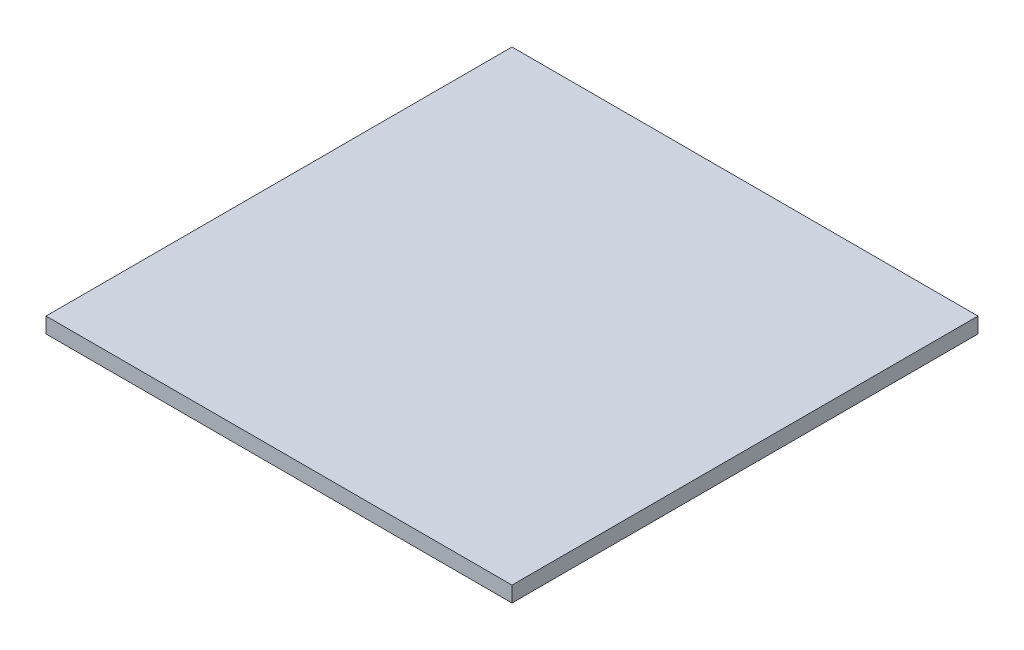
ISO-10303-21;
HEADER;
FILE_DESCRIPTION(('STEP AP214'),'2;1');
FILE_NAME('part.step','',(''),(''),'','','');
FILE_SCHEMA(('AUTOMOTIVE_DESIGN { 1 0 10303 214 1 1 1 1 }'));
ENDSEC;
DATA;
#1=APPLICATION_CONTEXT('core data for automotive mechanical design processes');
#2=APPLICATION_PROTOCOL_DEFINITION('international standard','automotive_design',2000,#1);
#3=PRODUCT_CONTEXT('',#1,'mechanical');
#4=PRODUCT('Part','Part','',(#3));
#5=PRODUCT_RELATED_PRODUCT_CATEGORY('part','',(#4));
#6=PRODUCT_DEFINITION_FORMATION('','',#4);
#7=PRODUCT_DEFINITION_CONTEXT('part definition',#1,'design');
#8=PRODUCT_DEFINITION('design','',#6,#7);
#9=PRODUCT_DEFINITION_SHAPE('','',#8);
#10=(LENGTH_UNIT() NAMED_UNIT(*) SI_UNIT(.MILLI.,.METRE.));
#11=(NAMED_UNIT(*) PLANE_ANGLE_UNIT() SI_UNIT($,.RADIAN.));
#12=(NAMED_UNIT(*) SI_UNIT($,.STERADIAN.) SOLID_ANGLE_UNIT());
#13=UNCERTAINTY_MEASURE_WITH_UNIT(LENGTH_MEASURE(1.E-05),#10,'distance_accuracy_value','');
#14=(GEOMETRIC_REPRESENTATION_CONTEXT(3) GLOBAL_UNCERTAINTY_ASSIGNED_CONTEXT((#13)) GLOBAL_UNIT_ASSIGNED_CONTEXT((#10,
#11,#12)) REPRESENTATION_CONTEXT('',''));
#15=CARTESIAN_POINT('',(0.,0.,0.));
#16=DIRECTION('',(0.,0.,1.));
#17=DIRECTION('',(1.,0.,0.));
#18=AXIS2_PLACEMENT_3D('',#15,#16,#17);
#19=CARTESIAN_POINT('',(-333.939300438532,5.,-243.36390582903));
#20=DIRECTION('',(1.,0.,0.));
#21=DIRECTION('',(0.,0.,-1.));
#22=AXIS2_PLACEMENT_3D('',#19,#20,#21);
#23=PLANE('',#22);
#24=DIRECTION('',(0.,0.,1.));
#25=VECTOR('',#24,1.);
#26=CARTESIAN_POINT('',(-333.939300438532,0.,-243.36390582903));
#27=LINE('',#26,#25);
#28=CARTESIAN_POINT('',(-333.939300438532,0.,-243.36390582903));
#29=VERTEX_POINT('',#28);
#30=CARTESIAN_POINT('',(-333.939300438532,0.,-93.3639058290303));
#31=VERTEX_POINT('',#30);
#32=EDGE_CURVE('E111',#29,#31,#27,.T.);
#33=ORIENTED_EDGE('',*,*,#32,.T.);
#34=DIRECTION('',(0.,-1.,0.));
#35=VECTOR('',#34,1.);
#36=CARTESIAN_POINT('',(-333.939300438532,5.,-93.3639058290303));
#37=LINE('',#36,#35);
#38=CARTESIAN_POINT('',(-333.939300438532,5.,-93.3639058290303));
#39=VERTEX_POINT('',#38);
#40=EDGE_CURVE('E100',#39,#31,#37,.T.);
#41=ORIENTED_EDGE('',*,*,#40,.F.);
#42=DIRECTION('',(0.,0.,1.));
#43=VECTOR('',#42,1.);
#44=CARTESIAN_POINT('',(-333.939300438532,5.,-243.36390582903));
#45=LINE('',#44,#43);
#46=CARTESIAN_POINT('',(-333.939300438532,5.,-243.36390582903));
#47=VERTEX_POINT('',#46);
#48=EDGE_CURVE('E92',#47,#39,#45,.T.);
#49=ORIENTED_EDGE('',*,*,#48,.F.);
#50=DIRECTION('',(0.,-1.,0.));
#51=VECTOR('',#50,1.);
#52=CARTESIAN_POINT('',(-333.939300438532,5.,-243.36390582903));
#53=LINE('',#52,#51);
#54=EDGE_CURVE('E107',#47,#29,#53,.T.);
#55=ORIENTED_EDGE('',*,*,#54,.T.);
#56=EDGE_LOOP('',(#33,#41,#49,#55));
#57=FACE_BOUND('',#56,.T.);
#58=ADVANCED_FACE('F39',(#57),#23,.F.);
#59=CARTESIAN_POINT('',(-333.939300438532,5.,-93.3639058290303));
#60=DIRECTION('',(0.,0.,-1.));
#61=DIRECTION('',(-1.,0.,0.));
#62=AXIS2_PLACEMENT_3D('',#59,#60,#61);
#63=PLANE('',#62);
#64=DIRECTION('',(1.,0.,0.));
#65=VECTOR('',#64,1.);
#66=CARTESIAN_POINT('',(-333.939300438532,0.,-93.3639058290303));
#67=LINE('',#66,#65);
#68=CARTESIAN_POINT('',(-183.939300438532,0.,-93.3639058290303));
#69=VERTEX_POINT('',#68);
#70=EDGE_CURVE('E98',#31,#69,#67,.T.);
#71=ORIENTED_EDGE('',*,*,#70,.T.);
#72=DIRECTION('',(0.,-1.,0.));
#73=VECTOR('',#72,1.);
#74=CARTESIAN_POINT('',(-183.939300438532,5.,-93.3639058290303));
#75=LINE('',#74,#73);
#76=CARTESIAN_POINT('',(-183.939300438532,5.,-93.3639058290303));
#77=VERTEX_POINT('',#76);
#78=EDGE_CURVE('E96',#77,#69,#75,.T.);
#79=ORIENTED_EDGE('',*,*,#78,.F.);
#80=DIRECTION('',(1.,0.,0.));
#81=VECTOR('',#80,1.);
#82=CARTESIAN_POINT('',(-333.939300438532,5.,-93.3639058290303));
#83=LINE('',#82,#81);
#84=EDGE_CURVE('E87',#39,#77,#83,.T.);
#85=ORIENTED_EDGE('',*,*,#84,.F.);
#86=ORIENTED_EDGE('',*,*,#40,.T.);
#87=EDGE_LOOP('',(#71,#79,#85,#86));
#88=FACE_BOUND('',#87,.T.);
#89=ADVANCED_FACE('F97',(#88),#63,.F.);
#90=CARTESIAN_POINT('',(-183.939300438532,5.,-243.36390582903));
#91=DIRECTION('',(-1.,0.,0.));
#92=DIRECTION('',(0.,0.,1.));
#93=AXIS2_PLACEMENT_3D('',#90,#91,#92);
#94=PLANE('',#93);
#95=DIRECTION('',(0.,0.,-1.));
#96=VECTOR('',#95,1.);
#97=CARTESIAN_POINT('',(-183.939300438532,0.,-243.36390582903));
#98=LINE('',#97,#96);
#99=CARTESIAN_POINT('',(-183.939300438532,0.,-243.36390582903));
#100=VERTEX_POINT('',#99);
#101=EDGE_CURVE('E73',#69,#100,#98,.T.);
#102=ORIENTED_EDGE('',*,*,#101,.T.);
#103=DIRECTION('',(0.,-1.,0.));
#104=VECTOR('',#103,1.);
#105=CARTESIAN_POINT('',(-183.939300438532,5.,-243.36390582903));
#106=LINE('',#105,#104);
#107=CARTESIAN_POINT('',(-183.939300438532,5.,-243.36390582903));
#108=VERTEX_POINT('',#107);
#109=EDGE_CURVE('E101',#108,#100,#106,.T.);
#110=ORIENTED_EDGE('',*,*,#109,.F.);
#111=DIRECTION('',(0.,0.,-1.));
#112=VECTOR('',#111,1.);
#113=CARTESIAN_POINT('',(-183.939300438532,5.,-243.36390582903));
#114=LINE('',#113,#112);
#115=EDGE_CURVE('E90',#77,#108,#114,.T.);
#116=ORIENTED_EDGE('',*,*,#115,.F.);
#117=ORIENTED_EDGE('',*,*,#78,.T.);
#118=EDGE_LOOP('',(#102,#110,#116,#117));
#119=FACE_BOUND('',#118,.T.);
#120=ADVANCED_FACE('F103',(#119),#94,.F.);
#121=CARTESIAN_POINT('',(-333.939300438532,5.,-243.36390582903));
#122=DIRECTION('',(0.,0.,1.));
#123=DIRECTION('',(1.,0.,0.));
#124=AXIS2_PLACEMENT_3D('',#121,#122,#123);
#125=PLANE('',#124);
#126=DIRECTION('',(-1.,0.,0.));
#127=VECTOR('',#126,1.);
#128=CARTESIAN_POINT('',(-333.939300438532,0.,-243.36390582903));
#129=LINE('',#128,#127);
#130=EDGE_CURVE('E79',#100,#29,#129,.T.);
#131=ORIENTED_EDGE('',*,*,#130,.T.);
#132=ORIENTED_EDGE('',*,*,#54,.F.);
#133=DIRECTION('',(-1.,0.,0.));
#134=VECTOR('',#133,1.);
#135=CARTESIAN_POINT('',(-333.939300438532,5.,-243.36390582903));
#136=LINE('',#135,#134);
#137=EDGE_CURVE('E56',#108,#47,#136,.T.);
#138=ORIENTED_EDGE('',*,*,#137,.F.);
#139=ORIENTED_EDGE('',*,*,#109,.T.);
#140=EDGE_LOOP('',(#131,#132,#138,#139));
#141=FACE_BOUND('',#140,.T.);
#142=ADVANCED_FACE('F153',(#141),#125,.F.);
#143=CARTESIAN_POINT('',(0.,5.,0.));
#144=DIRECTION('',(0.,1.,0.));
#145=DIRECTION('',(0.,0.,1.));
#146=AXIS2_PLACEMENT_3D('',#143,#144,#145);
#147=PLANE('',#146);
#148=ORIENTED_EDGE('',*,*,#48,.T.);
#149=ORIENTED_EDGE('',*,*,#84,.T.);
#150=ORIENTED_EDGE('',*,*,#115,.T.);
#151=ORIENTED_EDGE('',*,*,#137,.T.);
#152=EDGE_LOOP('',(#148,#149,#150,#151));
#153=FACE_BOUND('',#152,.T.);
#154=ADVANCED_FACE('F88',(#153),#147,.T.);
#155=CARTESIAN_POINT('',(0.,0.,0.));
#156=DIRECTION('',(0.,1.,0.));
#157=DIRECTION('',(0.,0.,1.));
#158=AXIS2_PLACEMENT_3D('',#155,#156,#157);
#159=PLANE('',#158);
#160=CARTESIAN_POINT('',(-226.439300438532,0.,-200.86390582903));
#161=DIRECTION('',(0.,1.,0.));
#162=DIRECTION('',(0.,0.,1.));
#163=AXIS2_PLACEMENT_3D('',#160,#161,#162);
#164=CIRCLE('',#163,4.99999999999999);
#165=CARTESIAN_POINT('',(-226.439300438532,0.,-195.86390582903));
#166=VERTEX_POINT('',#165);
#167=EDGE_CURVE('E11',#166,#166,#164,.F.);
#168=ORIENTED_EDGE('',*,*,#167,.F.);
#169=EDGE_LOOP('',(#168));
#170=FACE_BOUND('',#169,.T.);
#171=CARTESIAN_POINT('',(-291.439300438532,0.,-200.86390582903));
#172=DIRECTION('',(0.,1.,0.));
#173=DIRECTION('',(0.,0.,1.));
#174=AXIS2_PLACEMENT_3D('',#171,#172,#173);
#175=CIRCLE('',#174,4.99999999999999);
#176=CARTESIAN_POINT('',(-291.439300438532,0.,-195.86390582903));
#177=VERTEX_POINT('',#176);
#178=EDGE_CURVE('E48',#177,#177,#175,.F.);
#179=ORIENTED_EDGE('',*,*,#178,.F.);
#180=EDGE_LOOP('',(#179));
#181=FACE_BOUND('',#180,.T.);
#182=CARTESIAN_POINT('',(-226.439300438532,0.,-135.86390582903));
#183=DIRECTION('',(0.,1.,0.));
#184=DIRECTION('',(0.,0.,1.));
#185=AXIS2_PLACEMENT_3D('',#182,#183,#184);
#186=CIRCLE('',#185,4.99999999999999);
#187=CARTESIAN_POINT('',(-226.439300438532,0.,-130.86390582903));
#188=VERTEX_POINT('',#187);
#189=EDGE_CURVE('E132',#188,#188,#186,.F.);
#190=ORIENTED_EDGE('',*,*,#189,.F.);
#191=EDGE_LOOP('',(#190));
#192=FACE_BOUND('',#191,.T.);
#193=CARTESIAN_POINT('',(-291.439300438532,0.,-135.86390582903));
#194=DIRECTION('',(0.,1.,0.));
#195=DIRECTION('',(0.,0.,1.));
#196=AXIS2_PLACEMENT_3D('',#193,#194,#195);
#197=CIRCLE('',#196,4.99999999999999);
#198=CARTESIAN_POINT('',(-291.439300438532,0.,-130.86390582903));
#199=VERTEX_POINT('',#198);
#200=EDGE_CURVE('E128',#199,#199,#197,.F.);
#201=ORIENTED_EDGE('',*,*,#200,.F.);
#202=EDGE_LOOP('',(#201));
#203=FACE_BOUND('',#202,.T.);
#204=ORIENTED_EDGE('',*,*,#32,.F.);
#205=ORIENTED_EDGE('',*,*,#130,.F.);
#206=ORIENTED_EDGE('',*,*,#101,.F.);
#207=ORIENTED_EDGE('',*,*,#70,.F.);
#208=EDGE_LOOP('',(#204,#205,#206,#207));
#209=FACE_BOUND('',#208,.T.);
#210=ADVANCED_FACE('F141',(#170,#181,#192,#203,#209),#159,.F.);
#211=CARTESIAN_POINT('',(-291.439300438532,-15.,-135.86390582903));
#212=DIRECTION('',(0.,1.,0.));
#213=DIRECTION('',(0.,0.,1.));
#214=AXIS2_PLACEMENT_3D('',#211,#212,#213);
#215=CYLINDRICAL_SURFACE('',#214,4.99999999999999);
#216=CARTESIAN_POINT('',(-291.439300438532,-15.,-135.86390582903));
#217=DIRECTION('',(0.,-1.,0.));
#218=DIRECTION('',(0.,0.,-1.));
#219=AXIS2_PLACEMENT_3D('',#216,#217,#218);
#220=CIRCLE('',#219,4.99999999999999);
#221=CARTESIAN_POINT('',(-291.439300438532,-15.,-140.86390582903));
#222=VERTEX_POINT('',#221);
#223=EDGE_CURVE('E115',#222,#222,#220,.T.);
#224=ORIENTED_EDGE('',*,*,#223,.F.);
#225=EDGE_LOOP('',(#224));
#226=FACE_BOUND('',#225,.T.);
#227=ORIENTED_EDGE('',*,*,#200,.T.);
#228=EDGE_LOOP('',(#227));
#229=FACE_BOUND('',#228,.T.);
#230=ADVANCED_FACE('F144',(#226,#229),#215,.T.);
#231=CARTESIAN_POINT('',(0.,-15.,0.));
#232=DIRECTION('',(0.,-1.,0.));
#233=DIRECTION('',(0.,0.,-1.));
#234=AXIS2_PLACEMENT_3D('',#231,#232,#233);
#235=PLANE('',#234);
#236=CARTESIAN_POINT('',(-291.439300438532,-15.,-135.86390582903));
#237=DIRECTION('',(0.,-1.,0.));
#238=DIRECTION('',(0.,0.,-1.));
#239=AXIS2_PLACEMENT_3D('',#236,#237,#238);
#240=CIRCLE('',#239,1.50000000000002);
#241=CARTESIAN_POINT('',(-291.439300438532,-15.,-137.36390582903));
#242=VERTEX_POINT('',#241);
#243=EDGE_CURVE('E355',#242,#242,#240,.T.);
#244=ORIENTED_EDGE('',*,*,#243,.F.);
#245=EDGE_LOOP('',(#244));
#246=FACE_BOUND('',#245,.T.);
#247=ORIENTED_EDGE('',*,*,#223,.T.);
#248=EDGE_LOOP('',(#247));
#249=FACE_BOUND('',#248,.T.);
#250=ADVANCED_FACE('F197',(#246,#249),#235,.T.);
#251=CARTESIAN_POINT('',(-226.439300438532,-15.,-135.86390582903));
#252=DIRECTION('',(0.,1.,0.));
#253=DIRECTION('',(0.,0.,1.));
#254=AXIS2_PLACEMENT_3D('',#251,#252,#253);
#255=CYLINDRICAL_SURFACE('',#254,4.99999999999999);
#256=CARTESIAN_POINT('',(-226.439300438532,-15.,-135.86390582903));
#257=DIRECTION('',(0.,-1.,0.));
#258=DIRECTION('',(0.,0.,-1.));
#259=AXIS2_PLACEMENT_3D('',#256,#257,#258);
#260=CIRCLE('',#259,4.99999999999999);
#261=CARTESIAN_POINT('',(-226.439300438532,-15.,-140.86390582903));
#262=VERTEX_POINT('',#261);
#263=EDGE_CURVE('E372',#262,#262,#260,.T.);
#264=ORIENTED_EDGE('',*,*,#263,.F.);
#265=EDGE_LOOP('',(#264));
#266=FACE_BOUND('',#265,.T.);
#267=ORIENTED_EDGE('',*,*,#189,.T.);
#268=EDGE_LOOP('',(#267));
#269=FACE_BOUND('',#268,.T.);
#270=ADVANCED_FACE('F205',(#266,#269),#255,.T.);
#271=CARTESIAN_POINT('',(0.,-15.,0.));
#272=DIRECTION('',(0.,-1.,0.));
#273=DIRECTION('',(0.,0.,-1.));
#274=AXIS2_PLACEMENT_3D('',#271,#272,#273);
#275=PLANE('',#274);
#276=CARTESIAN_POINT('',(-226.439300438532,-15.,-135.86390582903));
#277=DIRECTION('',(0.,-1.,0.));
#278=DIRECTION('',(0.,0.,-1.));
#279=AXIS2_PLACEMENT_3D('',#276,#277,#278);
#280=CIRCLE('',#279,1.5);
#281=CARTESIAN_POINT('',(-226.439300438532,-15.,-137.36390582903));
#282=VERTEX_POINT('',#281);
#283=EDGE_CURVE('E394',#282,#282,#280,.T.);
#284=ORIENTED_EDGE('',*,*,#283,.F.);
#285=EDGE_LOOP('',(#284));
#286=FACE_BOUND('',#285,.T.);
#287=ORIENTED_EDGE('',*,*,#263,.T.);
#288=EDGE_LOOP('',(#287));
#289=FACE_BOUND('',#288,.T.);
#290=ADVANCED_FACE('F210',(#286,#289),#275,.T.);
#291=CARTESIAN_POINT('',(-291.439300438532,-15.,-200.86390582903));
#292=DIRECTION('',(0.,1.,0.));
#293=DIRECTION('',(0.,0.,1.));
#294=AXIS2_PLACEMENT_3D('',#291,#292,#293);
#295=CYLINDRICAL_SURFACE('',#294,4.99999999999999);
#296=CARTESIAN_POINT('',(-291.439300438532,-15.,-200.86390582903));
#297=DIRECTION('',(0.,-1.,0.));
#298=DIRECTION('',(0.,0.,-1.));
#299=AXIS2_PLACEMENT_3D('',#296,#297,#298);
#300=CIRCLE('',#299,4.99999999999999);
#301=CARTESIAN_POINT('',(-291.439300438532,-15.,-205.86390582903));
#302=VERTEX_POINT('',#301);
#303=EDGE_CURVE('E360',#302,#302,#300,.T.);
#304=ORIENTED_EDGE('',*,*,#303,.F.);
#305=EDGE_LOOP('',(#304));
#306=FACE_BOUND('',#305,.T.);
#307=ORIENTED_EDGE('',*,*,#178,.T.);
#308=EDGE_LOOP('',(#307));
#309=FACE_BOUND('',#308,.T.);
#310=ADVANCED_FACE('F139',(#306,#309),#295,.T.);
#311=CARTESIAN_POINT('',(0.,-15.,0.));
#312=DIRECTION('',(0.,-1.,0.));
#313=DIRECTION('',(0.,0.,-1.));
#314=AXIS2_PLACEMENT_3D('',#311,#312,#313);
#315=PLANE('',#314);
#316=CARTESIAN_POINT('',(-291.439300438532,-15.,-200.86390582903));
#317=DIRECTION('',(0.,-1.,0.));
#318=DIRECTION('',(0.,0.,-1.));
#319=AXIS2_PLACEMENT_3D('',#316,#317,#318);
#320=CIRCLE('',#319,1.50000000000002);
#321=CARTESIAN_POINT('',(-291.439300438532,-15.,-202.36390582903));
#322=VERTEX_POINT('',#321);
#323=EDGE_CURVE('E366',#322,#322,#320,.T.);
#324=ORIENTED_EDGE('',*,*,#323,.F.);
#325=EDGE_LOOP('',(#324));
#326=FACE_BOUND('',#325,.T.);
#327=ORIENTED_EDGE('',*,*,#303,.T.);
#328=EDGE_LOOP('',(#327));
#329=FACE_BOUND('',#328,.T.);
#330=ADVANCED_FACE('F222',(#326,#329),#315,.T.);
#331=CARTESIAN_POINT('',(-226.439300438532,-15.,-200.86390582903));
#332=DIRECTION('',(0.,1.,0.));
#333=DIRECTION('',(0.,0.,1.));
#334=AXIS2_PLACEMENT_3D('',#331,#332,#333);
#335=CYLINDRICAL_SURFACE('',#334,4.99999999999999);
#336=CARTESIAN_POINT('',(-226.439300438532,-15.,-200.86390582903));
#337=DIRECTION('',(0.,-1.,0.));
#338=DIRECTION('',(0.,0.,-1.));
#339=AXIS2_PLACEMENT_3D('',#336,#337,#338);
#340=CIRCLE('',#339,4.99999999999999);
#341=CARTESIAN_POINT('',(-226.439300438532,-15.,-205.86390582903));
#342=VERTEX_POINT('',#341);
#343=EDGE_CURVE('E354',#342,#342,#340,.T.);
#344=ORIENTED_EDGE('',*,*,#343,.F.);
#345=EDGE_LOOP('',(#344));
#346=FACE_BOUND('',#345,.T.);
#347=ORIENTED_EDGE('',*,*,#167,.T.);
#348=EDGE_LOOP('',(#347));
#349=FACE_BOUND('',#348,.T.);
#350=ADVANCED_FACE('F230',(#346,#349),#335,.T.);
#351=CARTESIAN_POINT('',(-226.439300438532,-15.,-200.86390582903));
#352=DIRECTION('',(0.,-1.,0.));
#353=DIRECTION('',(0.,0.,-1.));
#354=AXIS2_PLACEMENT_3D('',#351,#352,#353);
#355=PLANE('',#354);
#356=CARTESIAN_POINT('',(-226.439300438532,-15.,-200.86390582903));
#357=DIRECTION('',(0.,-1.,0.));
#358=DIRECTION('',(0.,0.,-1.));
#359=AXIS2_PLACEMENT_3D('',#356,#357,#358);
#360=CIRCLE('',#359,1.5);
#361=CARTESIAN_POINT('',(-226.439300438532,-15.,-202.36390582903));
#362=VERTEX_POINT('',#361);
#363=EDGE_CURVE('E401',#362,#362,#360,.T.);
#364=ORIENTED_EDGE('',*,*,#363,.F.);
#365=EDGE_LOOP('',(#364));
#366=FACE_BOUND('',#365,.T.);
#367=ORIENTED_EDGE('',*,*,#343,.T.);
#368=EDGE_LOOP('',(#367));
#369=FACE_BOUND('',#368,.T.);
#370=ADVANCED_FACE('F235',(#366,#369),#355,.T.);
#371=CARTESIAN_POINT('',(-226.439300438532,0.,-200.86390582903));
#372=DIRECTION('',(0.,-1.,0.));
#373=DIRECTION('',(0.,0.,-1.));
#374=AXIS2_PLACEMENT_3D('',#371,#372,#373);
#375=CYLINDRICAL_SURFACE('',#374,1.5);
#376=CARTESIAN_POINT('',(-226.439300438532,0.,-200.86390582903));
#377=DIRECTION('',(0.,-1.,0.));
#378=DIRECTION('',(0.,0.,-1.));
#379=AXIS2_PLACEMENT_3D('',#376,#377,#378);
#380=CIRCLE('',#379,1.5);
#381=CARTESIAN_POINT('',(-226.439300438532,0.,-202.36390582903));
#382=VERTEX_POINT('',#381);
#383=EDGE_CURVE('E390',#382,#382,#380,.T.);
#384=ORIENTED_EDGE('',*,*,#383,.F.);
#385=EDGE_LOOP('',(#384));
#386=FACE_BOUND('',#385,.T.);
#387=ORIENTED_EDGE('',*,*,#363,.T.);
#388=EDGE_LOOP('',(#387));
#389=FACE_BOUND('',#388,.T.);
#390=ADVANCED_FACE('F266',(#386,#389),#375,.F.);
#391=CARTESIAN_POINT('',(-226.439300438532,0.,-200.86390582903));
#392=DIRECTION('',(0.,-1.,0.));
#393=DIRECTION('',(0.,0.,-1.));
#394=AXIS2_PLACEMENT_3D('',#391,#392,#393);
#395=PLANE('',#394);
#396=ORIENTED_EDGE('',*,*,#383,.T.);
#397=EDGE_LOOP('',(#396));
#398=FACE_BOUND('',#397,.T.);
#399=ADVANCED_FACE('F276',(#398),#395,.T.);
#400=CARTESIAN_POINT('',(-291.439300438532,0.,-200.86390582903));
#401=DIRECTION('',(0.,-1.,0.));
#402=DIRECTION('',(0.,0.,-1.));
#403=AXIS2_PLACEMENT_3D('',#400,#401,#402);
#404=CYLINDRICAL_SURFACE('',#403,1.50000000000002);
#405=CARTESIAN_POINT('',(-291.439300438532,0.,-200.86390582903));
#406=DIRECTION('',(0.,-1.,0.));
#407=DIRECTION('',(0.,0.,-1.));
#408=AXIS2_PLACEMENT_3D('',#405,#406,#407);
#409=CIRCLE('',#408,1.50000000000002);
#410=CARTESIAN_POINT('',(-291.439300438532,0.,-202.36390582903));
#411=VERTEX_POINT('',#410);
#412=EDGE_CURVE('E389',#411,#411,#409,.T.);
#413=ORIENTED_EDGE('',*,*,#412,.F.);
#414=EDGE_LOOP('',(#413));
#415=FACE_BOUND('',#414,.T.);
#416=ORIENTED_EDGE('',*,*,#323,.T.);
#417=EDGE_LOOP('',(#416));
#418=FACE_BOUND('',#417,.T.);
#419=ADVANCED_FACE('F286',(#415,#418),#404,.F.);
#420=CARTESIAN_POINT('',(-291.439300438532,0.,-200.86390582903));
#421=DIRECTION('',(0.,-1.,0.));
#422=DIRECTION('',(0.,0.,-1.));
#423=AXIS2_PLACEMENT_3D('',#420,#421,#422);
#424=PLANE('',#423);
#425=ORIENTED_EDGE('',*,*,#412,.T.);
#426=EDGE_LOOP('',(#425));
#427=FACE_BOUND('',#426,.T.);
#428=ADVANCED_FACE('F296',(#427),#424,.T.);
#429=CARTESIAN_POINT('',(-226.439300438532,0.,-135.86390582903));
#430=DIRECTION('',(0.,-1.,0.));
#431=DIRECTION('',(0.,0.,-1.));
#432=AXIS2_PLACEMENT_3D('',#429,#430,#431);
#433=CYLINDRICAL_SURFACE('',#432,1.5);
#434=CARTESIAN_POINT('',(-226.439300438532,0.,-135.86390582903));
#435=DIRECTION('',(0.,-1.,0.));
#436=DIRECTION('',(0.,0.,-1.));
#437=AXIS2_PLACEMENT_3D('',#434,#435,#436);
#438=CIRCLE('',#437,1.5);
#439=CARTESIAN_POINT('',(-226.439300438532,0.,-137.36390582903));
#440=VERTEX_POINT('',#439);
#441=EDGE_CURVE('E363',#440,#440,#438,.T.);
#442=ORIENTED_EDGE('',*,*,#441,.F.);
#443=EDGE_LOOP('',(#442));
#444=FACE_BOUND('',#443,.T.);
#445=ORIENTED_EDGE('',*,*,#283,.T.);
#446=EDGE_LOOP('',(#445));
#447=FACE_BOUND('',#446,.T.);
#448=ADVANCED_FACE('F306',(#444,#447),#433,.F.);
#449=CARTESIAN_POINT('',(-226.439300438532,0.,-135.86390582903));
#450=DIRECTION('',(0.,-1.,0.));
#451=DIRECTION('',(0.,0.,-1.));
#452=AXIS2_PLACEMENT_3D('',#449,#450,#451);
#453=PLANE('',#452);
#454=ORIENTED_EDGE('',*,*,#441,.T.);
#455=EDGE_LOOP('',(#454));
#456=FACE_BOUND('',#455,.T.);
#457=ADVANCED_FACE('F316',(#456),#453,.T.);
#458=CARTESIAN_POINT('',(-291.439300438532,0.,-135.86390582903));
#459=DIRECTION('',(0.,-1.,0.));
#460=DIRECTION('',(0.,0.,-1.));
#461=AXIS2_PLACEMENT_3D('',#458,#459,#460);
#462=CYLINDRICAL_SURFACE('',#461,1.50000000000002);
#463=CARTESIAN_POINT('',(-291.439300438532,0.,-135.86390582903));
#464=DIRECTION('',(0.,-1.,0.));
#465=DIRECTION('',(0.,0.,-1.));
#466=AXIS2_PLACEMENT_3D('',#463,#464,#465);
#467=CIRCLE('',#466,1.50000000000002);
#468=CARTESIAN_POINT('',(-291.439300438532,0.,-137.36390582903));
#469=VERTEX_POINT('',#468);
#470=EDGE_CURVE('E352',#469,#469,#467,.T.);
#471=ORIENTED_EDGE('',*,*,#470,.F.);
#472=EDGE_LOOP('',(#471));
#473=FACE_BOUND('',#472,.T.);
#474=ORIENTED_EDGE('',*,*,#243,.T.);
#475=EDGE_LOOP('',(#474));
#476=FACE_BOUND('',#475,.T.);
#477=ADVANCED_FACE('F326',(#473,#476),#462,.F.);
#478=CARTESIAN_POINT('',(-291.439300438532,0.,-135.86390582903));
#479=DIRECTION('',(0.,-1.,0.));
#480=DIRECTION('',(0.,0.,-1.));
#481=AXIS2_PLACEMENT_3D('',#478,#479,#480);
#482=PLANE('',#481);
#483=ORIENTED_EDGE('',*,*,#470,.T.);
#484=EDGE_LOOP('',(#483));
#485=FACE_BOUND('',#484,.T.);
#486=ADVANCED_FACE('F336',(#485),#482,.T.);
#487=CLOSED_SHELL('',(#58,#89,#120,#142,#154,#210,#230,#250,#270,#290,#310,#330,#350,#370,#390,
#399,#419,#428,#448,#457,#477,#486));
#488=MANIFOLD_SOLID_BREP('B2',#487);
#489=ADVANCED_BREP_SHAPE_REPRESENTATION('',(#18,#488),#14);
#490=SHAPE_DEFINITION_REPRESENTATION(#9,#489);
ENDSEC;
END-ISO-10303-21;
